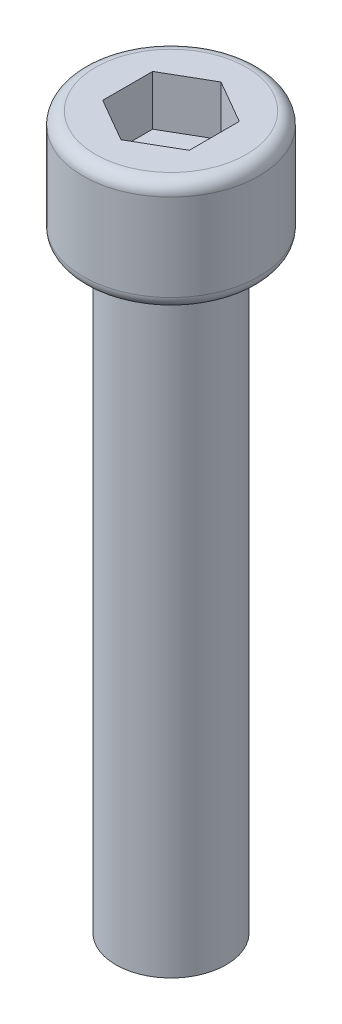
ISO-10303-21;
HEADER;
FILE_DESCRIPTION(('STEP AP214'),'2;1');
FILE_NAME('part.step','',(''),(''),'','','');
FILE_SCHEMA(('AUTOMOTIVE_DESIGN { 1 0 10303 214 1 1 1 1 }'));
ENDSEC;
DATA;
#1=APPLICATION_CONTEXT('core data for automotive mechanical design processes');
#2=APPLICATION_PROTOCOL_DEFINITION('international standard','automotive_design',2000,#1);
#3=PRODUCT_CONTEXT('',#1,'mechanical');
#4=PRODUCT('Part','Part','',(#3));
#5=PRODUCT_RELATED_PRODUCT_CATEGORY('part','',(#4));
#6=PRODUCT_DEFINITION_FORMATION('','',#4);
#7=PRODUCT_DEFINITION_CONTEXT('part definition',#1,'design');
#8=PRODUCT_DEFINITION('design','',#6,#7);
#9=PRODUCT_DEFINITION_SHAPE('','',#8);
#10=(LENGTH_UNIT() NAMED_UNIT(*) SI_UNIT(.MILLI.,.METRE.));
#11=(NAMED_UNIT(*) PLANE_ANGLE_UNIT() SI_UNIT($,.RADIAN.));
#12=(NAMED_UNIT(*) SI_UNIT($,.STERADIAN.) SOLID_ANGLE_UNIT());
#13=UNCERTAINTY_MEASURE_WITH_UNIT(LENGTH_MEASURE(1.E-05),#10,'distance_accuracy_value','');
#14=(GEOMETRIC_REPRESENTATION_CONTEXT(3) GLOBAL_UNCERTAINTY_ASSIGNED_CONTEXT((#13)) GLOBAL_UNIT_ASSIGNED_CONTEXT((#10,
#11,#12)) REPRESENTATION_CONTEXT('',''));
#15=CARTESIAN_POINT('',(0.,0.,0.));
#16=DIRECTION('',(0.,0.,1.));
#17=DIRECTION('',(1.,0.,0.));
#18=AXIS2_PLACEMENT_3D('',#15,#16,#17);
#19=CARTESIAN_POINT('',(0.,0.,0.));
#20=DIRECTION('',(0.,1.,0.));
#21=DIRECTION('',(0.,0.,1.));
#22=AXIS2_PLACEMENT_3D('',#19,#20,#21);
#23=PLANE('',#22);
#24=CARTESIAN_POINT('',(0.,0.,0.));
#25=DIRECTION('',(0.,1.,0.));
#26=DIRECTION('',(0.,0.,1.));
#27=AXIS2_PLACEMENT_3D('',#24,#25,#26);
#28=CIRCLE('',#27,2.397125);
#29=CARTESIAN_POINT('',(0.,0.,2.397125));
#30=VERTEX_POINT('',#29);
#31=EDGE_CURVE('E42',#30,#30,#28,.F.);
#32=ORIENTED_EDGE('',*,*,#31,.T.);
#33=EDGE_LOOP('',(#32));
#34=FACE_BOUND('',#33,.T.);
#35=CARTESIAN_POINT('',(0.,0.,0.));
#36=DIRECTION('',(0.,1.,0.));
#37=DIRECTION('',(0.,0.,1.));
#38=AXIS2_PLACEMENT_3D('',#35,#36,#37);
#39=CIRCLE('',#38,1.7526);
#40=CARTESIAN_POINT('',(0.,0.,1.7526));
#41=VERTEX_POINT('',#40);
#42=EDGE_CURVE('E144',#41,#41,#39,.F.);
#43=ORIENTED_EDGE('',*,*,#42,.F.);
#44=EDGE_LOOP('',(#43));
#45=FACE_BOUND('',#44,.T.);
#46=ADVANCED_FACE('F34',(#34,#45),#23,.F.);
#47=CARTESIAN_POINT('',(0.,3.556,0.));
#48=DIRECTION('',(0.,-1.,0.));
#49=DIRECTION('',(0.,0.,-1.));
#50=AXIS2_PLACEMENT_3D('',#47,#48,#49);
#51=CYLINDRICAL_SURFACE('',#50,2.794);
#52=CARTESIAN_POINT('',(0.,0.396875,0.));
#53=DIRECTION('',(0.,1.,0.));
#54=DIRECTION('',(0.,0.,1.));
#55=AXIS2_PLACEMENT_3D('',#52,#53,#54);
#56=CIRCLE('',#55,2.794);
#57=CARTESIAN_POINT('',(0.,0.396875,2.794));
#58=VERTEX_POINT('',#57);
#59=EDGE_CURVE('E150',#58,#58,#56,.T.);
#60=ORIENTED_EDGE('',*,*,#59,.T.);
#61=EDGE_LOOP('',(#60));
#62=FACE_BOUND('',#61,.T.);
#63=CARTESIAN_POINT('',(0.,3.159125,0.));
#64=DIRECTION('',(0.,1.,0.));
#65=DIRECTION('',(0.,0.,1.));
#66=AXIS2_PLACEMENT_3D('',#63,#64,#65);
#67=CIRCLE('',#66,2.794);
#68=CARTESIAN_POINT('',(0.,3.159125,2.794));
#69=VERTEX_POINT('',#68);
#70=EDGE_CURVE('E147',#69,#69,#67,.F.);
#71=ORIENTED_EDGE('',*,*,#70,.T.);
#72=EDGE_LOOP('',(#71));
#73=FACE_BOUND('',#72,.T.);
#74=ADVANCED_FACE('F163',(#62,#73),#51,.T.);
#75=CARTESIAN_POINT('',(0.,3.556,0.));
#76=DIRECTION('',(0.,1.,0.));
#77=DIRECTION('',(0.,0.,1.));
#78=AXIS2_PLACEMENT_3D('',#75,#76,#77);
#79=PLANE('',#78);
#80=DIRECTION('',(-0.866025403784439,0.,0.5));
#81=VECTOR('',#80,1.);
#82=CARTESIAN_POINT('',(0.,3.556,-1.5875));
#83=LINE('',#82,#81);
#84=CARTESIAN_POINT('',(0.,3.556,-1.5875));
#85=VERTEX_POINT('',#84);
#86=CARTESIAN_POINT('',(-1.3748153285078,3.556,-0.793749999999999));
#87=VERTEX_POINT('',#86);
#88=EDGE_CURVE('E49',#85,#87,#83,.T.);
#89=ORIENTED_EDGE('',*,*,#88,.F.);
#90=DIRECTION('',(-0.866025403784439,0.,-0.5));
#91=VECTOR('',#90,1.);
#92=CARTESIAN_POINT('',(1.3748153285078,3.556,-0.79375));
#93=LINE('',#92,#91);
#94=CARTESIAN_POINT('',(1.3748153285078,3.556,-0.79375));
#95=VERTEX_POINT('',#94);
#96=EDGE_CURVE('E132',#95,#85,#93,.T.);
#97=ORIENTED_EDGE('',*,*,#96,.F.);
#98=DIRECTION('',(0.,0.,-1.));
#99=VECTOR('',#98,1.);
#100=CARTESIAN_POINT('',(1.3748153285078,3.556,0.79375));
#101=LINE('',#100,#99);
#102=CARTESIAN_POINT('',(1.3748153285078,3.556,0.79375));
#103=VERTEX_POINT('',#102);
#104=EDGE_CURVE('E130',#103,#95,#101,.T.);
#105=ORIENTED_EDGE('',*,*,#104,.F.);
#106=DIRECTION('',(0.866025403784439,0.,-0.5));
#107=VECTOR('',#106,1.);
#108=CARTESIAN_POINT('',(0.,3.556,1.5875));
#109=LINE('',#108,#107);
#110=CARTESIAN_POINT('',(0.,3.556,1.5875));
#111=VERTEX_POINT('',#110);
#112=EDGE_CURVE('E97',#111,#103,#109,.T.);
#113=ORIENTED_EDGE('',*,*,#112,.F.);
#114=DIRECTION('',(0.866025403784439,0.,0.5));
#115=VECTOR('',#114,1.);
#116=CARTESIAN_POINT('',(-1.3748153285078,3.556,0.79375));
#117=LINE('',#116,#115);
#118=CARTESIAN_POINT('',(-1.3748153285078,3.556,0.79375));
#119=VERTEX_POINT('',#118);
#120=EDGE_CURVE('E126',#119,#111,#117,.T.);
#121=ORIENTED_EDGE('',*,*,#120,.F.);
#122=DIRECTION('',(0.,0.,1.));
#123=VECTOR('',#122,1.);
#124=CARTESIAN_POINT('',(-1.3748153285078,3.556,-0.793749999999999));
#125=LINE('',#124,#123);
#126=EDGE_CURVE('E123',#87,#119,#125,.T.);
#127=ORIENTED_EDGE('',*,*,#126,.F.);
#128=EDGE_LOOP('',(#89,#97,#105,#113,#121,#127));
#129=FACE_BOUND('',#128,.T.);
#130=CARTESIAN_POINT('',(0.,3.556,0.));
#131=DIRECTION('',(0.,1.,0.));
#132=DIRECTION('',(0.,0.,1.));
#133=AXIS2_PLACEMENT_3D('',#130,#131,#132);
#134=CIRCLE('',#133,2.397125);
#135=CARTESIAN_POINT('',(0.,3.556,2.397125));
#136=VERTEX_POINT('',#135);
#137=EDGE_CURVE('E11',#136,#136,#134,.T.);
#138=ORIENTED_EDGE('',*,*,#137,.T.);
#139=EDGE_LOOP('',(#138));
#140=FACE_BOUND('',#139,.T.);
#141=ADVANCED_FACE('F166',(#129,#140),#79,.T.);
#142=CARTESIAN_POINT('',(0.,-19.05,0.));
#143=DIRECTION('',(0.,1.,0.));
#144=DIRECTION('',(0.,0.,1.));
#145=AXIS2_PLACEMENT_3D('',#142,#143,#144);
#146=CYLINDRICAL_SURFACE('',#145,1.7526);
#147=CARTESIAN_POINT('',(0.,-19.05,0.));
#148=DIRECTION('',(0.,-1.,0.));
#149=DIRECTION('',(0.,0.,-1.));
#150=AXIS2_PLACEMENT_3D('',#147,#148,#149);
#151=CIRCLE('',#150,1.7526);
#152=CARTESIAN_POINT('',(0.,-19.05,1.7526));
#153=VERTEX_POINT('',#152);
#154=EDGE_CURVE('E136',#153,#153,#151,.T.);
#155=CARTESIAN_POINT('',(0.,-19.05,1.7526));
#156=CARTESIAN_POINT('',(0.,-18.8515625,1.7526));
#157=CARTESIAN_POINT('',(0.,-18.653125,1.7526));
#158=CARTESIAN_POINT('',(0.,-18.25625,1.7526));
#159=CARTESIAN_POINT('',(0.,-18.0578125,1.7526));
#160=CARTESIAN_POINT('',(0.,-17.6609375,1.7526));
#161=CARTESIAN_POINT('',(0.,-17.4625,1.7526));
#162=CARTESIAN_POINT('',(0.,-17.065625,1.7526));
#163=CARTESIAN_POINT('',(0.,-16.8671875,1.7526));
#164=CARTESIAN_POINT('',(0.,-16.4703125,1.7526));
#165=CARTESIAN_POINT('',(0.,-16.271875,1.7526));
#166=CARTESIAN_POINT('',(0.,-15.875,1.7526));
#167=CARTESIAN_POINT('',(0.,-15.6765625,1.7526));
#168=CARTESIAN_POINT('',(0.,-15.2796875,1.7526));
#169=CARTESIAN_POINT('',(0.,-15.08125,1.7526));
#170=CARTESIAN_POINT('',(0.,-14.684375,1.7526));
#171=CARTESIAN_POINT('',(0.,-14.4859375,1.7526));
#172=CARTESIAN_POINT('',(0.,-14.0890625,1.7526));
#173=CARTESIAN_POINT('',(0.,-13.890625,1.7526));
#174=CARTESIAN_POINT('',(0.,-13.49375,1.7526));
#175=CARTESIAN_POINT('',(0.,-13.2953125,1.7526));
#176=CARTESIAN_POINT('',(0.,-12.8984375,1.7526));
#177=CARTESIAN_POINT('',(0.,-12.7,1.7526));
#178=CARTESIAN_POINT('',(0.,-12.303125,1.7526));
#179=CARTESIAN_POINT('',(0.,-12.1046875,1.7526));
#180=CARTESIAN_POINT('',(0.,-11.7078125,1.7526));
#181=CARTESIAN_POINT('',(0.,-11.509375,1.7526));
#182=CARTESIAN_POINT('',(0.,-11.1125,1.7526));
#183=CARTESIAN_POINT('',(0.,-10.9140625,1.7526));
#184=CARTESIAN_POINT('',(0.,-10.5171875,1.7526));
#185=CARTESIAN_POINT('',(0.,-10.31875,1.7526));
#186=CARTESIAN_POINT('',(0.,-9.921875,1.7526));
#187=CARTESIAN_POINT('',(0.,-9.7234375,1.7526));
#188=CARTESIAN_POINT('',(0.,-9.3265625,1.7526));
#189=CARTESIAN_POINT('',(0.,-9.128125,1.7526));
#190=CARTESIAN_POINT('',(0.,-8.73125,1.7526));
#191=CARTESIAN_POINT('',(0.,-8.5328125,1.7526));
#192=CARTESIAN_POINT('',(0.,-8.1359375,1.7526));
#193=CARTESIAN_POINT('',(0.,-7.9375,1.7526));
#194=CARTESIAN_POINT('',(0.,-7.540625,1.7526));
#195=CARTESIAN_POINT('',(0.,-7.3421875,1.7526));
#196=CARTESIAN_POINT('',(0.,-6.9453125,1.7526));
#197=CARTESIAN_POINT('',(0.,-6.746875,1.7526));
#198=CARTESIAN_POINT('',(0.,-6.35,1.7526));
#199=CARTESIAN_POINT('',(0.,-6.1515625,1.7526));
#200=CARTESIAN_POINT('',(0.,-5.7546875,1.7526));
#201=CARTESIAN_POINT('',(0.,-5.55625,1.7526));
#202=CARTESIAN_POINT('',(0.,-5.159375,1.7526));
#203=CARTESIAN_POINT('',(0.,-4.9609375,1.7526));
#204=CARTESIAN_POINT('',(0.,-4.5640625,1.7526));
#205=CARTESIAN_POINT('',(0.,-4.365625,1.7526));
#206=CARTESIAN_POINT('',(0.,-3.96875,1.7526));
#207=CARTESIAN_POINT('',(0.,-3.7703125,1.7526));
#208=CARTESIAN_POINT('',(0.,-3.3734375,1.7526));
#209=CARTESIAN_POINT('',(0.,-3.175,1.7526));
#210=CARTESIAN_POINT('',(0.,-2.778125,1.7526));
#211=CARTESIAN_POINT('',(0.,-2.5796875,1.7526));
#212=CARTESIAN_POINT('',(0.,-2.1828125,1.7526));
#213=CARTESIAN_POINT('',(0.,-1.984375,1.7526));
#214=CARTESIAN_POINT('',(0.,-1.5875,1.7526));
#215=CARTESIAN_POINT('',(0.,-1.3890625,1.7526));
#216=CARTESIAN_POINT('',(0.,-0.992187500000001,1.7526));
#217=CARTESIAN_POINT('',(0.,-0.793750000000001,1.7526));
#218=CARTESIAN_POINT('',(0.,-0.396875,1.7526));
#219=CARTESIAN_POINT('',(0.,-0.1984375,1.7526));
#220=CARTESIAN_POINT('',(0.,0.,1.7526));
#221=B_SPLINE_CURVE_WITH_KNOTS('',3,(#155,#156,#157,#158,#159,#160,#161,#162,#163,#164,#165,
#166,#167,#168,#169,#170,#171,#172,#173,#174,#175,#176,#177,#178,#179,#180,#181,#182,#183,#184,
#185,#186,#187,#188,#189,#190,#191,#192,#193,#194,#195,#196,#197,#198,#199,#200,#201,#202,#203,
#204,#205,#206,#207,#208,#209,#210,#211,#212,#213,#214,#215,#216,#217,#218,#219,#220),
.UNSPECIFIED.,.F.,.F.,(4,2,2,2,2,2,2,2,2,2,2,2,2,2,2,2,2,2,2,2,2,2,2,2,2,2,2,2,2,2,2,2,4),(0.,
0.595312499999997,1.190625,1.7859375,2.38125,2.9765625,3.571875,4.1671875,4.7625,5.3578125,
5.953125,6.5484375,7.14375,7.7390625,8.334375,8.9296875,9.525,10.1203125,10.715625,11.3109375,
11.90625,12.5015625,13.096875,13.6921875,14.2875,14.8828125,15.478125,16.0734375,16.66875,
17.2640625,17.859375,18.4546875,19.05),.UNSPECIFIED.);
#222=EDGE_CURVE('BSEAM176',#153,#41,#221,.T.);
#223=ORIENTED_EDGE('',*,*,#154,.F.);
#224=ORIENTED_EDGE('',*,*,#42,.T.);
#225=ORIENTED_EDGE('',*,*,#222,.T.);
#226=ORIENTED_EDGE('',*,*,#222,.F.);
#227=EDGE_LOOP('',(#223,#225,#224,#226));
#228=FACE_BOUND('',#227,.T.);
#229=ADVANCED_FACE('F176',(#228),#146,.T.);
#230=CARTESIAN_POINT('',(0.,-19.05,0.));
#231=DIRECTION('',(0.,-1.,0.));
#232=DIRECTION('',(0.,0.,-1.));
#233=AXIS2_PLACEMENT_3D('',#230,#231,#232);
#234=PLANE('',#233);
#235=ORIENTED_EDGE('',*,*,#154,.T.);
#236=EDGE_LOOP('',(#235));
#237=FACE_BOUND('',#236,.T.);
#238=ADVANCED_FACE('F160',(#237),#234,.T.);
#239=CARTESIAN_POINT('',(0.,0.396875,0.));
#240=DIRECTION('',(0.,1.,0.));
#241=DIRECTION('',(0.,0.,1.));
#242=AXIS2_PLACEMENT_3D('',#239,#240,#241);
#243=TOROIDAL_SURFACE('',#242,2.397125,0.396875);
#244=ORIENTED_EDGE('',*,*,#31,.F.);
#245=EDGE_LOOP('',(#244));
#246=FACE_BOUND('',#245,.T.);
#247=ORIENTED_EDGE('',*,*,#59,.F.);
#248=EDGE_LOOP('',(#247));
#249=FACE_BOUND('',#248,.T.);
#250=ADVANCED_FACE('F157',(#246,#249),#243,.T.);
#251=CARTESIAN_POINT('',(0.,3.159125,0.));
#252=DIRECTION('',(0.,1.,0.));
#253=DIRECTION('',(0.,0.,1.));
#254=AXIS2_PLACEMENT_3D('',#251,#252,#253);
#255=TOROIDAL_SURFACE('',#254,2.397125,0.396875);
#256=ORIENTED_EDGE('',*,*,#70,.F.);
#257=EDGE_LOOP('',(#256));
#258=FACE_BOUND('',#257,.T.);
#259=ORIENTED_EDGE('',*,*,#137,.F.);
#260=EDGE_LOOP('',(#259));
#261=FACE_BOUND('',#260,.T.);
#262=ADVANCED_FACE('F36',(#258,#261),#255,.T.);
#263=CARTESIAN_POINT('',(0.,1.9685,-1.5875));
#264=DIRECTION('',(-0.5,0.,-0.866025403784439));
#265=DIRECTION('',(-0.866025403784439,0.,0.5));
#266=AXIS2_PLACEMENT_3D('',#263,#264,#265);
#267=PLANE('',#266);
#268=ORIENTED_EDGE('',*,*,#88,.T.);
#269=DIRECTION('',(0.,1.,0.));
#270=VECTOR('',#269,1.);
#271=CARTESIAN_POINT('',(-1.3748153285078,1.9685,-0.793749999999999));
#272=LINE('',#271,#270);
#273=CARTESIAN_POINT('',(-1.3748153285078,1.9685,-0.793749999999999));
#274=VERTEX_POINT('',#273);
#275=EDGE_CURVE('E79',#274,#87,#272,.T.);
#276=ORIENTED_EDGE('',*,*,#275,.F.);
#277=DIRECTION('',(-0.866025403784439,0.,0.5));
#278=VECTOR('',#277,1.);
#279=CARTESIAN_POINT('',(0.,1.9685,-1.5875));
#280=LINE('',#279,#278);
#281=CARTESIAN_POINT('',(0.,1.9685,-1.5875));
#282=VERTEX_POINT('',#281);
#283=EDGE_CURVE('E134',#282,#274,#280,.T.);
#284=ORIENTED_EDGE('',*,*,#283,.F.);
#285=DIRECTION('',(0.,1.,0.));
#286=VECTOR('',#285,1.);
#287=CARTESIAN_POINT('',(0.,1.9685,-1.5875));
#288=LINE('',#287,#286);
#289=EDGE_CURVE('E57',#282,#85,#288,.T.);
#290=ORIENTED_EDGE('',*,*,#289,.T.);
#291=EDGE_LOOP('',(#268,#276,#284,#290));
#292=FACE_BOUND('',#291,.T.);
#293=ADVANCED_FACE('F172',(#292),#267,.F.);
#294=CARTESIAN_POINT('',(1.3748153285078,1.9685,-0.79375));
#295=DIRECTION('',(0.5,0.,-0.866025403784439));
#296=DIRECTION('',(-0.866025403784439,0.,-0.5));
#297=AXIS2_PLACEMENT_3D('',#294,#295,#296);
#298=PLANE('',#297);
#299=ORIENTED_EDGE('',*,*,#96,.T.);
#300=ORIENTED_EDGE('',*,*,#289,.F.);
#301=DIRECTION('',(-0.866025403784439,0.,-0.5));
#302=VECTOR('',#301,1.);
#303=CARTESIAN_POINT('',(1.3748153285078,1.9685,-0.79375));
#304=LINE('',#303,#302);
#305=CARTESIAN_POINT('',(1.3748153285078,1.9685,-0.79375));
#306=VERTEX_POINT('',#305);
#307=EDGE_CURVE('E109',#306,#282,#304,.T.);
#308=ORIENTED_EDGE('',*,*,#307,.F.);
#309=DIRECTION('',(0.,1.,0.));
#310=VECTOR('',#309,1.);
#311=CARTESIAN_POINT('',(1.3748153285078,1.9685,-0.79375));
#312=LINE('',#311,#310);
#313=EDGE_CURVE('E101',#306,#95,#312,.T.);
#314=ORIENTED_EDGE('',*,*,#313,.T.);
#315=EDGE_LOOP('',(#299,#300,#308,#314));
#316=FACE_BOUND('',#315,.T.);
#317=ADVANCED_FACE('F220',(#316),#298,.F.);
#318=CARTESIAN_POINT('',(1.3748153285078,1.9685,0.79375));
#319=DIRECTION('',(1.,0.,0.));
#320=DIRECTION('',(0.,0.,-1.));
#321=AXIS2_PLACEMENT_3D('',#318,#319,#320);
#322=PLANE('',#321);
#323=ORIENTED_EDGE('',*,*,#104,.T.);
#324=ORIENTED_EDGE('',*,*,#313,.F.);
#325=DIRECTION('',(0.,0.,-1.));
#326=VECTOR('',#325,1.);
#327=CARTESIAN_POINT('',(1.3748153285078,1.9685,0.79375));
#328=LINE('',#327,#326);
#329=CARTESIAN_POINT('',(1.3748153285078,1.9685,0.79375));
#330=VERTEX_POINT('',#329);
#331=EDGE_CURVE('E105',#330,#306,#328,.T.);
#332=ORIENTED_EDGE('',*,*,#331,.F.);
#333=DIRECTION('',(0.,1.,0.));
#334=VECTOR('',#333,1.);
#335=CARTESIAN_POINT('',(1.3748153285078,1.9685,0.79375));
#336=LINE('',#335,#334);
#337=EDGE_CURVE('E90',#330,#103,#336,.T.);
#338=ORIENTED_EDGE('',*,*,#337,.T.);
#339=EDGE_LOOP('',(#323,#324,#332,#338));
#340=FACE_BOUND('',#339,.T.);
#341=ADVANCED_FACE('F106',(#340),#322,.F.);
#342=CARTESIAN_POINT('',(0.,1.9685,1.5875));
#343=DIRECTION('',(0.5,0.,0.866025403784438));
#344=DIRECTION('',(0.866025403784439,0.,-0.5));
#345=AXIS2_PLACEMENT_3D('',#342,#343,#344);
#346=PLANE('',#345);
#347=ORIENTED_EDGE('',*,*,#112,.T.);
#348=ORIENTED_EDGE('',*,*,#337,.F.);
#349=DIRECTION('',(0.866025403784439,0.,-0.5));
#350=VECTOR('',#349,1.);
#351=CARTESIAN_POINT('',(0.,1.9685,1.5875));
#352=LINE('',#351,#350);
#353=CARTESIAN_POINT('',(0.,1.9685,1.5875));
#354=VERTEX_POINT('',#353);
#355=EDGE_CURVE('E94',#354,#330,#352,.T.);
#356=ORIENTED_EDGE('',*,*,#355,.F.);
#357=DIRECTION('',(0.,1.,0.));
#358=VECTOR('',#357,1.);
#359=CARTESIAN_POINT('',(0.,1.9685,1.5875));
#360=LINE('',#359,#358);
#361=EDGE_CURVE('E102',#354,#111,#360,.T.);
#362=ORIENTED_EDGE('',*,*,#361,.T.);
#363=EDGE_LOOP('',(#347,#348,#356,#362));
#364=FACE_BOUND('',#363,.T.);
#365=ADVANCED_FACE('F92',(#364),#346,.F.);
#366=CARTESIAN_POINT('',(-1.3748153285078,1.9685,0.79375));
#367=DIRECTION('',(-0.5,0.,0.866025403784439));
#368=DIRECTION('',(0.866025403784439,0.,0.5));
#369=AXIS2_PLACEMENT_3D('',#366,#367,#368);
#370=PLANE('',#369);
#371=ORIENTED_EDGE('',*,*,#120,.T.);
#372=ORIENTED_EDGE('',*,*,#361,.F.);
#373=DIRECTION('',(0.866025403784439,0.,0.5));
#374=VECTOR('',#373,1.);
#375=CARTESIAN_POINT('',(-1.3748153285078,1.9685,0.79375));
#376=LINE('',#375,#374);
#377=CARTESIAN_POINT('',(-1.3748153285078,1.9685,0.79375));
#378=VERTEX_POINT('',#377);
#379=EDGE_CURVE('E115',#378,#354,#376,.T.);
#380=ORIENTED_EDGE('',*,*,#379,.F.);
#381=DIRECTION('',(0.,1.,0.));
#382=VECTOR('',#381,1.);
#383=CARTESIAN_POINT('',(-1.3748153285078,1.9685,0.79375));
#384=LINE('',#383,#382);
#385=EDGE_CURVE('E139',#378,#119,#384,.T.);
#386=ORIENTED_EDGE('',*,*,#385,.T.);
#387=EDGE_LOOP('',(#371,#372,#380,#386));
#388=FACE_BOUND('',#387,.T.);
#389=ADVANCED_FACE('F245',(#388),#370,.F.);
#390=CARTESIAN_POINT('',(-1.3748153285078,1.9685,-0.793749999999999));
#391=DIRECTION('',(-1.,0.,0.));
#392=DIRECTION('',(0.,0.,1.));
#393=AXIS2_PLACEMENT_3D('',#390,#391,#392);
#394=PLANE('',#393);
#395=ORIENTED_EDGE('',*,*,#126,.T.);
#396=ORIENTED_EDGE('',*,*,#385,.F.);
#397=DIRECTION('',(0.,0.,1.));
#398=VECTOR('',#397,1.);
#399=CARTESIAN_POINT('',(-1.3748153285078,1.9685,-0.793749999999999));
#400=LINE('',#399,#398);
#401=EDGE_CURVE('E117',#274,#378,#400,.T.);
#402=ORIENTED_EDGE('',*,*,#401,.F.);
#403=ORIENTED_EDGE('',*,*,#275,.T.);
#404=EDGE_LOOP('',(#395,#396,#402,#403));
#405=FACE_BOUND('',#404,.T.);
#406=ADVANCED_FACE('F254',(#405),#394,.F.);
#407=CARTESIAN_POINT('',(0.,1.9685,0.));
#408=DIRECTION('',(0.,1.,0.));
#409=DIRECTION('',(0.,0.,1.));
#410=AXIS2_PLACEMENT_3D('',#407,#408,#409);
#411=PLANE('',#410);
#412=ORIENTED_EDGE('',*,*,#283,.T.);
#413=ORIENTED_EDGE('',*,*,#401,.T.);
#414=ORIENTED_EDGE('',*,*,#379,.T.);
#415=ORIENTED_EDGE('',*,*,#355,.T.);
#416=ORIENTED_EDGE('',*,*,#331,.T.);
#417=ORIENTED_EDGE('',*,*,#307,.T.);
#418=EDGE_LOOP('',(#412,#413,#414,#415,#416,#417));
#419=FACE_BOUND('',#418,.T.);
#420=ADVANCED_FACE('F112',(#419),#411,.T.);
#421=CLOSED_SHELL('',(#46,#74,#141,#229,#238,#250,#262,#293,#317,#341,#365,#389,#406,#420));
#422=MANIFOLD_SOLID_BREP('B2',#421);
#423=ADVANCED_BREP_SHAPE_REPRESENTATION('',(#18,#422),#14);
#424=SHAPE_DEFINITION_REPRESENTATION(#9,#423);
ENDSEC;
END-ISO-10303-21;
